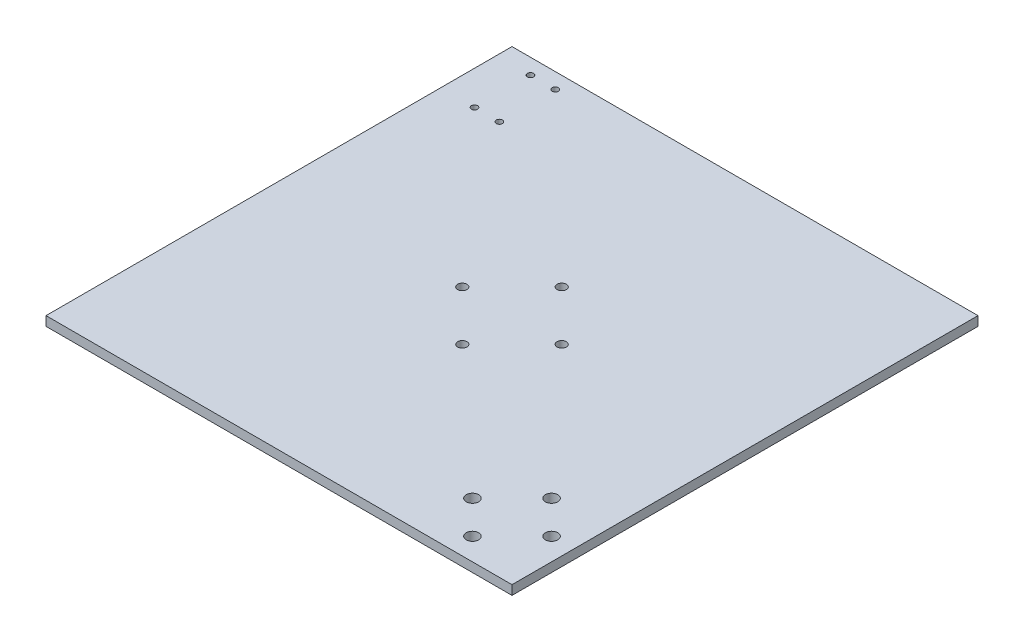
ISO-10303-21;
HEADER;
FILE_DESCRIPTION(('STEP AP214'),'2;1');
FILE_NAME('part.step','',(''),(''),'','','');
FILE_SCHEMA(('AUTOMOTIVE_DESIGN { 1 0 10303 214 1 1 1 1 }'));
ENDSEC;
DATA;
#1=APPLICATION_CONTEXT('core data for automotive mechanical design processes');
#2=APPLICATION_PROTOCOL_DEFINITION('international standard','automotive_design',2000,#1);
#3=PRODUCT_CONTEXT('',#1,'mechanical');
#4=PRODUCT('Part','Part','',(#3));
#5=PRODUCT_RELATED_PRODUCT_CATEGORY('part','',(#4));
#6=PRODUCT_DEFINITION_FORMATION('','',#4);
#7=PRODUCT_DEFINITION_CONTEXT('part definition',#1,'design');
#8=PRODUCT_DEFINITION('design','',#6,#7);
#9=PRODUCT_DEFINITION_SHAPE('','',#8);
#10=(LENGTH_UNIT() NAMED_UNIT(*) SI_UNIT(.MILLI.,.METRE.));
#11=(NAMED_UNIT(*) PLANE_ANGLE_UNIT() SI_UNIT($,.RADIAN.));
#12=(NAMED_UNIT(*) SI_UNIT($,.STERADIAN.) SOLID_ANGLE_UNIT());
#13=UNCERTAINTY_MEASURE_WITH_UNIT(LENGTH_MEASURE(1.E-05),#10,'distance_accuracy_value','');
#14=(GEOMETRIC_REPRESENTATION_CONTEXT(3) GLOBAL_UNCERTAINTY_ASSIGNED_CONTEXT((#13)) GLOBAL_UNIT_ASSIGNED_CONTEXT((#10,
#11,#12)) REPRESENTATION_CONTEXT('',''));
#15=CARTESIAN_POINT('',(0.,0.,0.));
#16=DIRECTION('',(0.,0.,1.));
#17=DIRECTION('',(1.,0.,0.));
#18=AXIS2_PLACEMENT_3D('',#15,#16,#17);
#19=CARTESIAN_POINT('',(0.,3.,0.));
#20=DIRECTION('',(1.,0.,0.));
#21=DIRECTION('',(0.,0.,-1.));
#22=AXIS2_PLACEMENT_3D('',#19,#20,#21);
#23=PLANE('',#22);
#24=DIRECTION('',(0.,0.,1.));
#25=VECTOR('',#24,1.);
#26=CARTESIAN_POINT('',(0.,0.,0.));
#27=LINE('',#26,#25);
#28=CARTESIAN_POINT('',(0.,0.,-150.));
#29=VERTEX_POINT('',#28);
#30=CARTESIAN_POINT('',(0.,0.,0.));
#31=VERTEX_POINT('',#30);
#32=EDGE_CURVE('E109',#29,#31,#27,.T.);
#33=ORIENTED_EDGE('',*,*,#32,.T.);
#34=DIRECTION('',(0.,-1.,0.));
#35=VECTOR('',#34,1.);
#36=CARTESIAN_POINT('',(0.,3.,0.));
#37=LINE('',#36,#35);
#38=CARTESIAN_POINT('',(0.,3.,0.));
#39=VERTEX_POINT('',#38);
#40=EDGE_CURVE('E11',#39,#31,#37,.T.);
#41=ORIENTED_EDGE('',*,*,#40,.F.);
#42=DIRECTION('',(0.,0.,1.));
#43=VECTOR('',#42,1.);
#44=CARTESIAN_POINT('',(0.,3.,0.));
#45=LINE('',#44,#43);
#46=CARTESIAN_POINT('',(0.,3.,-150.));
#47=VERTEX_POINT('',#46);
#48=EDGE_CURVE('E92',#47,#39,#45,.T.);
#49=ORIENTED_EDGE('',*,*,#48,.F.);
#50=DIRECTION('',(0.,-1.,0.));
#51=VECTOR('',#50,1.);
#52=CARTESIAN_POINT('',(0.,3.,-150.));
#53=LINE('',#52,#51);
#54=EDGE_CURVE('E105',#47,#29,#53,.T.);
#55=ORIENTED_EDGE('',*,*,#54,.T.);
#56=EDGE_LOOP('',(#33,#41,#49,#55));
#57=FACE_BOUND('',#56,.T.);
#58=ADVANCED_FACE('F38',(#57),#23,.F.);
#59=CARTESIAN_POINT('',(0.,3.,0.));
#60=DIRECTION('',(0.,0.,-1.));
#61=DIRECTION('',(-1.,0.,0.));
#62=AXIS2_PLACEMENT_3D('',#59,#60,#61);
#63=PLANE('',#62);
#64=DIRECTION('',(1.,0.,0.));
#65=VECTOR('',#64,1.);
#66=CARTESIAN_POINT('',(0.,0.,0.));
#67=LINE('',#66,#65);
#68=CARTESIAN_POINT('',(150.,0.,0.));
#69=VERTEX_POINT('',#68);
#70=EDGE_CURVE('E97',#31,#69,#67,.T.);
#71=ORIENTED_EDGE('',*,*,#70,.T.);
#72=DIRECTION('',(0.,-1.,0.));
#73=VECTOR('',#72,1.);
#74=CARTESIAN_POINT('',(150.,3.,0.));
#75=LINE('',#74,#73);
#76=CARTESIAN_POINT('',(150.,3.,0.));
#77=VERTEX_POINT('',#76);
#78=EDGE_CURVE('E48',#77,#69,#75,.T.);
#79=ORIENTED_EDGE('',*,*,#78,.F.);
#80=DIRECTION('',(1.,0.,0.));
#81=VECTOR('',#80,1.);
#82=CARTESIAN_POINT('',(0.,3.,0.));
#83=LINE('',#82,#81);
#84=EDGE_CURVE('E87',#39,#77,#83,.T.);
#85=ORIENTED_EDGE('',*,*,#84,.F.);
#86=ORIENTED_EDGE('',*,*,#40,.T.);
#87=EDGE_LOOP('',(#71,#79,#85,#86));
#88=FACE_BOUND('',#87,.T.);
#89=ADVANCED_FACE('F96',(#88),#63,.F.);
#90=CARTESIAN_POINT('',(150.,3.,0.));
#91=DIRECTION('',(-1.,0.,0.));
#92=DIRECTION('',(0.,0.,1.));
#93=AXIS2_PLACEMENT_3D('',#90,#91,#92);
#94=PLANE('',#93);
#95=DIRECTION('',(0.,0.,-1.));
#96=VECTOR('',#95,1.);
#97=CARTESIAN_POINT('',(150.,0.,0.));
#98=LINE('',#97,#96);
#99=CARTESIAN_POINT('',(150.,0.,-150.));
#100=VERTEX_POINT('',#99);
#101=EDGE_CURVE('E74',#69,#100,#98,.T.);
#102=ORIENTED_EDGE('',*,*,#101,.T.);
#103=DIRECTION('',(0.,-1.,0.));
#104=VECTOR('',#103,1.);
#105=CARTESIAN_POINT('',(150.,3.,-150.));
#106=LINE('',#105,#104);
#107=CARTESIAN_POINT('',(150.,3.,-150.));
#108=VERTEX_POINT('',#107);
#109=EDGE_CURVE('E99',#108,#100,#106,.T.);
#110=ORIENTED_EDGE('',*,*,#109,.F.);
#111=DIRECTION('',(0.,0.,-1.));
#112=VECTOR('',#111,1.);
#113=CARTESIAN_POINT('',(150.,3.,0.));
#114=LINE('',#113,#112);
#115=EDGE_CURVE('E90',#77,#108,#114,.T.);
#116=ORIENTED_EDGE('',*,*,#115,.F.);
#117=ORIENTED_EDGE('',*,*,#78,.T.);
#118=EDGE_LOOP('',(#102,#110,#116,#117));
#119=FACE_BOUND('',#118,.T.);
#120=ADVANCED_FACE('F101',(#119),#94,.F.);
#121=CARTESIAN_POINT('',(0.,3.,-150.));
#122=DIRECTION('',(0.,0.,1.));
#123=DIRECTION('',(1.,0.,0.));
#124=AXIS2_PLACEMENT_3D('',#121,#122,#123);
#125=PLANE('',#124);
#126=DIRECTION('',(-1.,0.,0.));
#127=VECTOR('',#126,1.);
#128=CARTESIAN_POINT('',(0.,0.,-150.));
#129=LINE('',#128,#127);
#130=EDGE_CURVE('E80',#100,#29,#129,.T.);
#131=ORIENTED_EDGE('',*,*,#130,.T.);
#132=ORIENTED_EDGE('',*,*,#54,.F.);
#133=DIRECTION('',(-1.,0.,0.));
#134=VECTOR('',#133,1.);
#135=CARTESIAN_POINT('',(0.,3.,-150.));
#136=LINE('',#135,#134);
#137=EDGE_CURVE('E57',#108,#47,#136,.T.);
#138=ORIENTED_EDGE('',*,*,#137,.F.);
#139=ORIENTED_EDGE('',*,*,#109,.T.);
#140=EDGE_LOOP('',(#131,#132,#138,#139));
#141=FACE_BOUND('',#140,.T.);
#142=ADVANCED_FACE('F215',(#141),#125,.F.);
#143=CARTESIAN_POINT('',(0.,3.,0.));
#144=DIRECTION('',(0.,-1.,0.));
#145=DIRECTION('',(0.,0.,-1.));
#146=AXIS2_PLACEMENT_3D('',#143,#144,#145);
#147=PLANE('',#146);
#148=CARTESIAN_POINT('',(132.27569115356,3.,-30.4522727891561));
#149=DIRECTION('',(0.,1.,0.));
#150=DIRECTION('',(0.,0.,1.));
#151=AXIS2_PLACEMENT_3D('',#148,#149,#150);
#152=CIRCLE('',#151,2.);
#153=CARTESIAN_POINT('',(132.27569115356,3.,-28.4522727891561));
#154=VERTEX_POINT('',#153);
#155=EDGE_CURVE('E161',#154,#154,#152,.T.);
#156=ORIENTED_EDGE('',*,*,#155,.F.);
#157=EDGE_LOOP('',(#156));
#158=FACE_BOUND('',#157,.T.);
#159=CARTESIAN_POINT('',(119.547769092202,3.,-17.7243507277982));
#160=DIRECTION('',(0.,1.,0.));
#161=DIRECTION('',(0.,0.,1.));
#162=AXIS2_PLACEMENT_3D('',#159,#160,#161);
#163=CIRCLE('',#162,2.);
#164=CARTESIAN_POINT('',(119.547769092202,3.,-15.7243507277982));
#165=VERTEX_POINT('',#164);
#166=EDGE_CURVE('E334',#165,#165,#163,.T.);
#167=ORIENTED_EDGE('',*,*,#166,.F.);
#168=EDGE_LOOP('',(#167));
#169=FACE_BOUND('',#168,.T.);
#170=CARTESIAN_POINT('',(130.15437081,3.,-7.11774901));
#171=DIRECTION('',(0.,1.,0.));
#172=DIRECTION('',(0.,0.,1.));
#173=AXIS2_PLACEMENT_3D('',#170,#171,#172);
#174=CIRCLE('',#173,2.00000000000003);
#175=CARTESIAN_POINT('',(130.15437081,3.,-5.11774900999997));
#176=VERTEX_POINT('',#175);
#177=EDGE_CURVE('E338',#176,#176,#174,.T.);
#178=ORIENTED_EDGE('',*,*,#177,.F.);
#179=EDGE_LOOP('',(#178));
#180=FACE_BOUND('',#179,.T.);
#181=CARTESIAN_POINT('',(142.882292871358,3.,-19.8456710713579));
#182=DIRECTION('',(0.,1.,0.));
#183=DIRECTION('',(0.,0.,1.));
#184=AXIS2_PLACEMENT_3D('',#181,#182,#183);
#185=CIRCLE('',#184,2.00000000000003);
#186=CARTESIAN_POINT('',(142.882292871358,3.,-17.8456710713579));
#187=VERTEX_POINT('',#186);
#188=EDGE_CURVE('E343',#187,#187,#185,.T.);
#189=ORIENTED_EDGE('',*,*,#188,.F.);
#190=EDGE_LOOP('',(#189));
#191=FACE_BOUND('',#190,.T.);
#192=CARTESIAN_POINT('',(75.,3.,-59.));
#193=DIRECTION('',(0.,1.,0.));
#194=DIRECTION('',(0.,0.,1.));
#195=AXIS2_PLACEMENT_3D('',#192,#193,#194);
#196=CIRCLE('',#195,1.5);
#197=CARTESIAN_POINT('',(75.,3.,-57.5));
#198=VERTEX_POINT('',#197);
#199=EDGE_CURVE('E129',#198,#198,#196,.T.);
#200=ORIENTED_EDGE('',*,*,#199,.F.);
#201=EDGE_LOOP('',(#200));
#202=FACE_BOUND('',#201,.T.);
#203=CARTESIAN_POINT('',(10.93,3.,-145.));
#204=DIRECTION('',(0.,1.,0.));
#205=DIRECTION('',(0.,0.,1.));
#206=AXIS2_PLACEMENT_3D('',#203,#204,#205);
#207=CIRCLE('',#206,1.00000000000001);
#208=CARTESIAN_POINT('',(10.93,3.,-144.));
#209=VERTEX_POINT('',#208);
#210=EDGE_CURVE('E182',#209,#209,#207,.T.);
#211=ORIENTED_EDGE('',*,*,#210,.F.);
#212=EDGE_LOOP('',(#211));
#213=FACE_BOUND('',#212,.T.);
#214=CARTESIAN_POINT('',(18.93,3.,-127.));
#215=DIRECTION('',(0.,1.,0.));
#216=DIRECTION('',(0.,0.,1.));
#217=AXIS2_PLACEMENT_3D('',#214,#215,#216);
#218=CIRCLE('',#217,1.00000000000002);
#219=CARTESIAN_POINT('',(18.93,3.,-126.));
#220=VERTEX_POINT('',#219);
#221=EDGE_CURVE('E176',#220,#220,#218,.T.);
#222=ORIENTED_EDGE('',*,*,#221,.F.);
#223=EDGE_LOOP('',(#222));
#224=FACE_BOUND('',#223,.T.);
#225=CARTESIAN_POINT('',(10.93,3.,-127.));
#226=DIRECTION('',(0.,1.,0.));
#227=DIRECTION('',(0.,0.,1.));
#228=AXIS2_PLACEMENT_3D('',#225,#226,#227);
#229=CIRCLE('',#228,1.00000000000002);
#230=CARTESIAN_POINT('',(10.93,3.,-126.));
#231=VERTEX_POINT('',#230);
#232=EDGE_CURVE('E171',#231,#231,#229,.T.);
#233=ORIENTED_EDGE('',*,*,#232,.F.);
#234=EDGE_LOOP('',(#233));
#235=FACE_BOUND('',#234,.T.);
#236=CARTESIAN_POINT('',(59.,3.,-75.));
#237=DIRECTION('',(0.,1.,0.));
#238=DIRECTION('',(0.,0.,1.));
#239=AXIS2_PLACEMENT_3D('',#236,#237,#238);
#240=CIRCLE('',#239,1.50000000000001);
#241=CARTESIAN_POINT('',(59.,3.,-73.5));
#242=VERTEX_POINT('',#241);
#243=EDGE_CURVE('E199',#242,#242,#240,.T.);
#244=ORIENTED_EDGE('',*,*,#243,.F.);
#245=EDGE_LOOP('',(#244));
#246=FACE_BOUND('',#245,.T.);
#247=CARTESIAN_POINT('',(75.,3.,-91.));
#248=DIRECTION('',(0.,1.,0.));
#249=DIRECTION('',(0.,0.,1.));
#250=AXIS2_PLACEMENT_3D('',#247,#248,#249);
#251=CIRCLE('',#250,1.5);
#252=CARTESIAN_POINT('',(75.,3.,-89.5));
#253=VERTEX_POINT('',#252);
#254=EDGE_CURVE('E195',#253,#253,#251,.T.);
#255=ORIENTED_EDGE('',*,*,#254,.F.);
#256=EDGE_LOOP('',(#255));
#257=FACE_BOUND('',#256,.T.);
#258=CARTESIAN_POINT('',(91.,3.,-75.));
#259=DIRECTION('',(0.,1.,0.));
#260=DIRECTION('',(0.,0.,1.));
#261=AXIS2_PLACEMENT_3D('',#258,#259,#260);
#262=CIRCLE('',#261,1.5);
#263=CARTESIAN_POINT('',(91.,3.,-73.5));
#264=VERTEX_POINT('',#263);
#265=EDGE_CURVE('E191',#264,#264,#262,.T.);
#266=ORIENTED_EDGE('',*,*,#265,.F.);
#267=EDGE_LOOP('',(#266));
#268=FACE_BOUND('',#267,.T.);
#269=CARTESIAN_POINT('',(18.93,3.,-145.));
#270=DIRECTION('',(0.,1.,0.));
#271=DIRECTION('',(0.,0.,1.));
#272=AXIS2_PLACEMENT_3D('',#269,#270,#271);
#273=CIRCLE('',#272,0.999999999999998);
#274=CARTESIAN_POINT('',(18.93,3.,-144.));
#275=VERTEX_POINT('',#274);
#276=EDGE_CURVE('E189',#275,#275,#273,.T.);
#277=ORIENTED_EDGE('',*,*,#276,.F.);
#278=EDGE_LOOP('',(#277));
#279=FACE_BOUND('',#278,.T.);
#280=ORIENTED_EDGE('',*,*,#48,.T.);
#281=ORIENTED_EDGE('',*,*,#84,.T.);
#282=ORIENTED_EDGE('',*,*,#115,.T.);
#283=ORIENTED_EDGE('',*,*,#137,.T.);
#284=EDGE_LOOP('',(#280,#281,#282,#283));
#285=FACE_BOUND('',#284,.T.);
#286=ADVANCED_FACE('F88',(#158,#169,#180,#191,#202,#213,#224,#235,#246,#257,#268,#279,#285),
#147,.F.);
#287=CARTESIAN_POINT('',(0.,0.,0.));
#288=DIRECTION('',(0.,-1.,0.));
#289=DIRECTION('',(0.,0.,-1.));
#290=AXIS2_PLACEMENT_3D('',#287,#288,#289);
#291=PLANE('',#290);
#292=CARTESIAN_POINT('',(132.27569115356,0.,-30.4522727891561));
#293=DIRECTION('',(0.,-1.,0.));
#294=DIRECTION('',(0.,0.,-1.));
#295=AXIS2_PLACEMENT_3D('',#292,#293,#294);
#296=CIRCLE('',#295,2.);
#297=CARTESIAN_POINT('',(132.27569115356,0.,-32.452272789156));
#298=VERTEX_POINT('',#297);
#299=EDGE_CURVE('E41',#298,#298,#296,.T.);
#300=ORIENTED_EDGE('',*,*,#299,.F.);
#301=EDGE_LOOP('',(#300));
#302=FACE_BOUND('',#301,.T.);
#303=CARTESIAN_POINT('',(119.547769092202,0.,-17.7243507277982));
#304=DIRECTION('',(0.,-1.,0.));
#305=DIRECTION('',(0.,0.,-1.));
#306=AXIS2_PLACEMENT_3D('',#303,#304,#305);
#307=CIRCLE('',#306,2.);
#308=CARTESIAN_POINT('',(119.547769092202,0.,-19.7243507277982));
#309=VERTEX_POINT('',#308);
#310=EDGE_CURVE('E164',#309,#309,#307,.T.);
#311=ORIENTED_EDGE('',*,*,#310,.F.);
#312=EDGE_LOOP('',(#311));
#313=FACE_BOUND('',#312,.T.);
#314=CARTESIAN_POINT('',(130.15437081,0.,-7.11774901));
#315=DIRECTION('',(0.,-1.,0.));
#316=DIRECTION('',(0.,0.,-1.));
#317=AXIS2_PLACEMENT_3D('',#314,#315,#316);
#318=CIRCLE('',#317,2.00000000000003);
#319=CARTESIAN_POINT('',(130.15437081,0.,-9.11774901000003));
#320=VERTEX_POINT('',#319);
#321=EDGE_CURVE('E160',#320,#320,#318,.T.);
#322=ORIENTED_EDGE('',*,*,#321,.F.);
#323=EDGE_LOOP('',(#322));
#324=FACE_BOUND('',#323,.T.);
#325=CARTESIAN_POINT('',(142.882292871358,0.,-19.8456710713579));
#326=DIRECTION('',(0.,-1.,0.));
#327=DIRECTION('',(0.,0.,-1.));
#328=AXIS2_PLACEMENT_3D('',#325,#326,#327);
#329=CIRCLE('',#328,2.00000000000003);
#330=CARTESIAN_POINT('',(142.882292871358,0.,-21.8456710713579));
#331=VERTEX_POINT('',#330);
#332=EDGE_CURVE('E156',#331,#331,#329,.T.);
#333=ORIENTED_EDGE('',*,*,#332,.F.);
#334=EDGE_LOOP('',(#333));
#335=FACE_BOUND('',#334,.T.);
#336=CARTESIAN_POINT('',(75.,0.,-59.));
#337=DIRECTION('',(0.,-1.,0.));
#338=DIRECTION('',(0.,0.,-1.));
#339=AXIS2_PLACEMENT_3D('',#336,#337,#338);
#340=CIRCLE('',#339,1.5);
#341=CARTESIAN_POINT('',(75.,0.,-60.5));
#342=VERTEX_POINT('',#341);
#343=EDGE_CURVE('E113',#342,#342,#340,.T.);
#344=ORIENTED_EDGE('',*,*,#343,.F.);
#345=EDGE_LOOP('',(#344));
#346=FACE_BOUND('',#345,.T.);
#347=CARTESIAN_POINT('',(10.93,0.,-145.));
#348=DIRECTION('',(0.,-1.,0.));
#349=DIRECTION('',(0.,0.,-1.));
#350=AXIS2_PLACEMENT_3D('',#347,#348,#349);
#351=CIRCLE('',#350,1.00000000000001);
#352=CARTESIAN_POINT('',(10.93,0.,-146.));
#353=VERTEX_POINT('',#352);
#354=EDGE_CURVE('E149',#353,#353,#351,.T.);
#355=ORIENTED_EDGE('',*,*,#354,.F.);
#356=EDGE_LOOP('',(#355));
#357=FACE_BOUND('',#356,.T.);
#358=CARTESIAN_POINT('',(18.93,0.,-127.));
#359=DIRECTION('',(0.,-1.,0.));
#360=DIRECTION('',(0.,0.,-1.));
#361=AXIS2_PLACEMENT_3D('',#358,#359,#360);
#362=CIRCLE('',#361,1.00000000000002);
#363=CARTESIAN_POINT('',(18.93,0.,-128.));
#364=VERTEX_POINT('',#363);
#365=EDGE_CURVE('E145',#364,#364,#362,.T.);
#366=ORIENTED_EDGE('',*,*,#365,.F.);
#367=EDGE_LOOP('',(#366));
#368=FACE_BOUND('',#367,.T.);
#369=CARTESIAN_POINT('',(10.93,0.,-127.));
#370=DIRECTION('',(0.,-1.,0.));
#371=DIRECTION('',(0.,0.,-1.));
#372=AXIS2_PLACEMENT_3D('',#369,#370,#371);
#373=CIRCLE('',#372,1.00000000000002);
#374=CARTESIAN_POINT('',(10.93,0.,-128.));
#375=VERTEX_POINT('',#374);
#376=EDGE_CURVE('E141',#375,#375,#373,.T.);
#377=ORIENTED_EDGE('',*,*,#376,.F.);
#378=EDGE_LOOP('',(#377));
#379=FACE_BOUND('',#378,.T.);
#380=CARTESIAN_POINT('',(59.,0.,-75.));
#381=DIRECTION('',(0.,-1.,0.));
#382=DIRECTION('',(0.,0.,-1.));
#383=AXIS2_PLACEMENT_3D('',#380,#381,#382);
#384=CIRCLE('',#383,1.50000000000001);
#385=CARTESIAN_POINT('',(59.,0.,-76.5));
#386=VERTEX_POINT('',#385);
#387=EDGE_CURVE('E137',#386,#386,#384,.T.);
#388=ORIENTED_EDGE('',*,*,#387,.F.);
#389=EDGE_LOOP('',(#388));
#390=FACE_BOUND('',#389,.T.);
#391=CARTESIAN_POINT('',(75.,0.,-91.));
#392=DIRECTION('',(0.,-1.,0.));
#393=DIRECTION('',(0.,0.,-1.));
#394=AXIS2_PLACEMENT_3D('',#391,#392,#393);
#395=CIRCLE('',#394,1.5);
#396=CARTESIAN_POINT('',(75.,0.,-92.5));
#397=VERTEX_POINT('',#396);
#398=EDGE_CURVE('E133',#397,#397,#395,.T.);
#399=ORIENTED_EDGE('',*,*,#398,.F.);
#400=EDGE_LOOP('',(#399));
#401=FACE_BOUND('',#400,.T.);
#402=CARTESIAN_POINT('',(91.,0.,-75.));
#403=DIRECTION('',(0.,-1.,0.));
#404=DIRECTION('',(0.,0.,-1.));
#405=AXIS2_PLACEMENT_3D('',#402,#403,#404);
#406=CIRCLE('',#405,1.5);
#407=CARTESIAN_POINT('',(91.,0.,-76.5));
#408=VERTEX_POINT('',#407);
#409=EDGE_CURVE('E128',#408,#408,#406,.T.);
#410=ORIENTED_EDGE('',*,*,#409,.F.);
#411=EDGE_LOOP('',(#410));
#412=FACE_BOUND('',#411,.T.);
#413=CARTESIAN_POINT('',(18.93,0.,-145.));
#414=DIRECTION('',(0.,-1.,0.));
#415=DIRECTION('',(0.,0.,-1.));
#416=AXIS2_PLACEMENT_3D('',#413,#414,#415);
#417=CIRCLE('',#416,0.999999999999998);
#418=CARTESIAN_POINT('',(18.93,0.,-146.));
#419=VERTEX_POINT('',#418);
#420=EDGE_CURVE('E124',#419,#419,#417,.T.);
#421=ORIENTED_EDGE('',*,*,#420,.F.);
#422=EDGE_LOOP('',(#421));
#423=FACE_BOUND('',#422,.T.);
#424=ORIENTED_EDGE('',*,*,#32,.F.);
#425=ORIENTED_EDGE('',*,*,#130,.F.);
#426=ORIENTED_EDGE('',*,*,#101,.F.);
#427=ORIENTED_EDGE('',*,*,#70,.F.);
#428=EDGE_LOOP('',(#424,#425,#426,#427));
#429=FACE_BOUND('',#428,.T.);
#430=ADVANCED_FACE('F214',(#302,#313,#324,#335,#346,#357,#368,#379,#390,#401,#412,#423,#429),
#291,.T.);
#431=CARTESIAN_POINT('',(18.93,-7.,-145.));
#432=DIRECTION('',(0.,1.,0.));
#433=DIRECTION('',(0.,0.,1.));
#434=AXIS2_PLACEMENT_3D('',#431,#432,#433);
#435=CYLINDRICAL_SURFACE('',#434,0.999999999999998);
#436=ORIENTED_EDGE('',*,*,#420,.T.);
#437=EDGE_LOOP('',(#436));
#438=FACE_BOUND('',#437,.T.);
#439=ORIENTED_EDGE('',*,*,#276,.T.);
#440=EDGE_LOOP('',(#439));
#441=FACE_BOUND('',#440,.T.);
#442=ADVANCED_FACE('F231',(#438,#441),#435,.F.);
#443=CARTESIAN_POINT('',(91.,-7.,-75.));
#444=DIRECTION('',(0.,1.,0.));
#445=DIRECTION('',(0.,0.,1.));
#446=AXIS2_PLACEMENT_3D('',#443,#444,#445);
#447=CYLINDRICAL_SURFACE('',#446,1.5);
#448=ORIENTED_EDGE('',*,*,#409,.T.);
#449=EDGE_LOOP('',(#448));
#450=FACE_BOUND('',#449,.T.);
#451=ORIENTED_EDGE('',*,*,#265,.T.);
#452=EDGE_LOOP('',(#451));
#453=FACE_BOUND('',#452,.T.);
#454=ADVANCED_FACE('F233',(#450,#453),#447,.F.);
#455=CARTESIAN_POINT('',(75.,-7.,-91.));
#456=DIRECTION('',(0.,1.,0.));
#457=DIRECTION('',(0.,0.,1.));
#458=AXIS2_PLACEMENT_3D('',#455,#456,#457);
#459=CYLINDRICAL_SURFACE('',#458,1.5);
#460=ORIENTED_EDGE('',*,*,#398,.T.);
#461=EDGE_LOOP('',(#460));
#462=FACE_BOUND('',#461,.T.);
#463=ORIENTED_EDGE('',*,*,#254,.T.);
#464=EDGE_LOOP('',(#463));
#465=FACE_BOUND('',#464,.T.);
#466=ADVANCED_FACE('F240',(#462,#465),#459,.F.);
#467=CARTESIAN_POINT('',(59.,-7.,-75.));
#468=DIRECTION('',(0.,1.,0.));
#469=DIRECTION('',(0.,0.,1.));
#470=AXIS2_PLACEMENT_3D('',#467,#468,#469);
#471=CYLINDRICAL_SURFACE('',#470,1.50000000000001);
#472=ORIENTED_EDGE('',*,*,#387,.T.);
#473=EDGE_LOOP('',(#472));
#474=FACE_BOUND('',#473,.T.);
#475=ORIENTED_EDGE('',*,*,#243,.T.);
#476=EDGE_LOOP('',(#475));
#477=FACE_BOUND('',#476,.T.);
#478=ADVANCED_FACE('F263',(#474,#477),#471,.F.);
#479=CARTESIAN_POINT('',(10.93,-7.,-127.));
#480=DIRECTION('',(0.,1.,0.));
#481=DIRECTION('',(0.,0.,1.));
#482=AXIS2_PLACEMENT_3D('',#479,#480,#481);
#483=CYLINDRICAL_SURFACE('',#482,1.00000000000002);
#484=ORIENTED_EDGE('',*,*,#376,.T.);
#485=EDGE_LOOP('',(#484));
#486=FACE_BOUND('',#485,.T.);
#487=ORIENTED_EDGE('',*,*,#232,.T.);
#488=EDGE_LOOP('',(#487));
#489=FACE_BOUND('',#488,.T.);
#490=ADVANCED_FACE('F266',(#486,#489),#483,.F.);
#491=CARTESIAN_POINT('',(18.93,-7.,-127.));
#492=DIRECTION('',(0.,1.,0.));
#493=DIRECTION('',(0.,0.,1.));
#494=AXIS2_PLACEMENT_3D('',#491,#492,#493);
#495=CYLINDRICAL_SURFACE('',#494,1.00000000000002);
#496=ORIENTED_EDGE('',*,*,#365,.T.);
#497=EDGE_LOOP('',(#496));
#498=FACE_BOUND('',#497,.T.);
#499=ORIENTED_EDGE('',*,*,#221,.T.);
#500=EDGE_LOOP('',(#499));
#501=FACE_BOUND('',#500,.T.);
#502=ADVANCED_FACE('F271',(#498,#501),#495,.F.);
#503=CARTESIAN_POINT('',(10.93,-7.,-145.));
#504=DIRECTION('',(0.,1.,0.));
#505=DIRECTION('',(0.,0.,1.));
#506=AXIS2_PLACEMENT_3D('',#503,#504,#505);
#507=CYLINDRICAL_SURFACE('',#506,1.00000000000001);
#508=ORIENTED_EDGE('',*,*,#354,.T.);
#509=EDGE_LOOP('',(#508));
#510=FACE_BOUND('',#509,.T.);
#511=ORIENTED_EDGE('',*,*,#210,.T.);
#512=EDGE_LOOP('',(#511));
#513=FACE_BOUND('',#512,.T.);
#514=ADVANCED_FACE('F288',(#510,#513),#507,.F.);
#515=CARTESIAN_POINT('',(75.,-7.,-59.));
#516=DIRECTION('',(0.,1.,0.));
#517=DIRECTION('',(0.,0.,1.));
#518=AXIS2_PLACEMENT_3D('',#515,#516,#517);
#519=CYLINDRICAL_SURFACE('',#518,1.5);
#520=ORIENTED_EDGE('',*,*,#343,.T.);
#521=EDGE_LOOP('',(#520));
#522=FACE_BOUND('',#521,.T.);
#523=ORIENTED_EDGE('',*,*,#199,.T.);
#524=EDGE_LOOP('',(#523));
#525=FACE_BOUND('',#524,.T.);
#526=ADVANCED_FACE('F210',(#522,#525),#519,.F.);
#527=CARTESIAN_POINT('',(142.882292871358,-7.,-19.8456710713579));
#528=DIRECTION('',(0.,1.,0.));
#529=DIRECTION('',(0.,0.,1.));
#530=AXIS2_PLACEMENT_3D('',#527,#528,#529);
#531=CYLINDRICAL_SURFACE('',#530,2.00000000000003);
#532=ORIENTED_EDGE('',*,*,#332,.T.);
#533=EDGE_LOOP('',(#532));
#534=FACE_BOUND('',#533,.T.);
#535=ORIENTED_EDGE('',*,*,#188,.T.);
#536=EDGE_LOOP('',(#535));
#537=FACE_BOUND('',#536,.T.);
#538=ADVANCED_FACE('F299',(#534,#537),#531,.F.);
#539=CARTESIAN_POINT('',(130.15437081,-7.,-7.11774901));
#540=DIRECTION('',(0.,1.,0.));
#541=DIRECTION('',(0.,0.,1.));
#542=AXIS2_PLACEMENT_3D('',#539,#540,#541);
#543=CYLINDRICAL_SURFACE('',#542,2.00000000000003);
#544=ORIENTED_EDGE('',*,*,#321,.T.);
#545=EDGE_LOOP('',(#544));
#546=FACE_BOUND('',#545,.T.);
#547=ORIENTED_EDGE('',*,*,#177,.T.);
#548=EDGE_LOOP('',(#547));
#549=FACE_BOUND('',#548,.T.);
#550=ADVANCED_FACE('F312',(#546,#549),#543,.F.);
#551=CARTESIAN_POINT('',(119.547769092202,-7.,-17.7243507277982));
#552=DIRECTION('',(0.,1.,0.));
#553=DIRECTION('',(0.,0.,1.));
#554=AXIS2_PLACEMENT_3D('',#551,#552,#553);
#555=CYLINDRICAL_SURFACE('',#554,2.);
#556=ORIENTED_EDGE('',*,*,#310,.T.);
#557=EDGE_LOOP('',(#556));
#558=FACE_BOUND('',#557,.T.);
#559=ORIENTED_EDGE('',*,*,#166,.T.);
#560=EDGE_LOOP('',(#559));
#561=FACE_BOUND('',#560,.T.);
#562=ADVANCED_FACE('F319',(#558,#561),#555,.F.);
#563=CARTESIAN_POINT('',(132.27569115356,-7.,-30.4522727891561));
#564=DIRECTION('',(0.,1.,0.));
#565=DIRECTION('',(0.,0.,1.));
#566=AXIS2_PLACEMENT_3D('',#563,#564,#565);
#567=CYLINDRICAL_SURFACE('',#566,2.);
#568=ORIENTED_EDGE('',*,*,#299,.T.);
#569=EDGE_LOOP('',(#568));
#570=FACE_BOUND('',#569,.T.);
#571=ORIENTED_EDGE('',*,*,#155,.T.);
#572=EDGE_LOOP('',(#571));
#573=FACE_BOUND('',#572,.T.);
#574=ADVANCED_FACE('F326',(#570,#573),#567,.F.);
#575=CLOSED_SHELL('',(#58,#89,#120,#142,#286,#430,#442,#454,#466,#478,#490,#502,#514,#526,#538,
#550,#562,#574));
#576=MANIFOLD_SOLID_BREP('B2',#575);
#577=ADVANCED_BREP_SHAPE_REPRESENTATION('',(#18,#576),#14);
#578=SHAPE_DEFINITION_REPRESENTATION(#9,#577);
ENDSEC;
END-ISO-10303-21;
